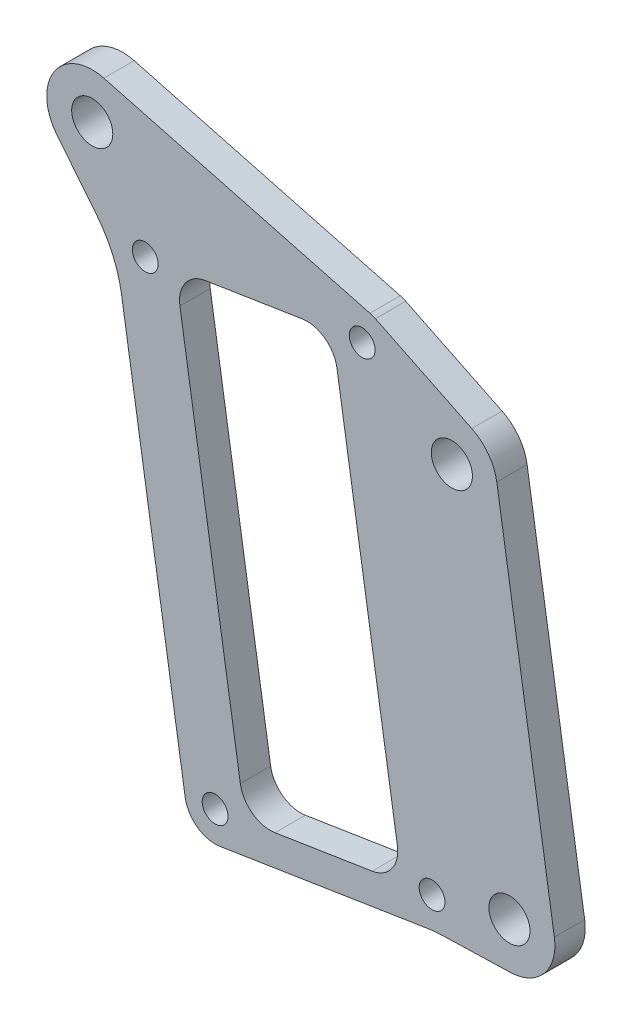
ISO-10303-21;
HEADER;
FILE_DESCRIPTION(('STEP AP214'),'2;1');
FILE_NAME('part.step','',(''),(''),'','','');
FILE_SCHEMA(('AUTOMOTIVE_DESIGN { 1 0 10303 214 1 1 1 1 }'));
ENDSEC;
DATA;
#1=APPLICATION_CONTEXT('core data for automotive mechanical design processes');
#2=APPLICATION_PROTOCOL_DEFINITION('international standard','automotive_design',2000,#1);
#3=PRODUCT_CONTEXT('',#1,'mechanical');
#4=PRODUCT('Part','Part','',(#3));
#5=PRODUCT_RELATED_PRODUCT_CATEGORY('part','',(#4));
#6=PRODUCT_DEFINITION_FORMATION('','',#4);
#7=PRODUCT_DEFINITION_CONTEXT('part definition',#1,'design');
#8=PRODUCT_DEFINITION('design','',#6,#7);
#9=PRODUCT_DEFINITION_SHAPE('','',#8);
#10=(LENGTH_UNIT() NAMED_UNIT(*) SI_UNIT(.MILLI.,.METRE.));
#11=(NAMED_UNIT(*) PLANE_ANGLE_UNIT() SI_UNIT($,.RADIAN.));
#12=(NAMED_UNIT(*) SI_UNIT($,.STERADIAN.) SOLID_ANGLE_UNIT());
#13=UNCERTAINTY_MEASURE_WITH_UNIT(LENGTH_MEASURE(1.E-05),#10,'distance_accuracy_value','');
#14=(GEOMETRIC_REPRESENTATION_CONTEXT(3) GLOBAL_UNCERTAINTY_ASSIGNED_CONTEXT((#13)) GLOBAL_UNIT_ASSIGNED_CONTEXT((#10,
#11,#12)) REPRESENTATION_CONTEXT('',''));
#15=CARTESIAN_POINT('',(0.,0.,0.));
#16=DIRECTION('',(0.,0.,1.));
#17=DIRECTION('',(1.,0.,0.));
#18=AXIS2_PLACEMENT_3D('',#15,#16,#17);
#19=CARTESIAN_POINT('',(8.90303426536302,-56.484662563122,3.175));
#20=DIRECTION('',(0.155696447577263,-0.987804948464939,0.));
#21=DIRECTION('',(0.987804948464939,0.155696447577263,0.));
#22=AXIS2_PLACEMENT_3D('',#19,#20,#21);
#23=PLANE('',#22);
#24=DIRECTION('',(-0.987804948464939,-0.155696447577263,0.));
#25=VECTOR('',#24,1.);
#26=CARTESIAN_POINT('',(8.90303426536302,-56.484662563122,3.175));
#27=LINE('',#26,#25);
#28=CARTESIAN_POINT('',(29.3160235253921,-53.2671954739377,3.175));
#29=VERTEX_POINT('',#28);
#30=CARTESIAN_POINT('',(19.1416325562032,-54.8708688839835,3.175));
#31=VERTEX_POINT('',#30);
#32=EDGE_CURVE('E367',#29,#31,#27,.T.);
#33=ORIENTED_EDGE('',*,*,#32,.F.);
#34=DIRECTION('',(0.,0.,-1.));
#35=VECTOR('',#34,1.);
#36=CARTESIAN_POINT('',(29.316023525392,-53.2671954739377,3.175));
#37=LINE('',#36,#35);
#38=CARTESIAN_POINT('',(29.3160235253921,-53.2671954739377,0.));
#39=VERTEX_POINT('',#38);
#40=EDGE_CURVE('E211',#29,#39,#37,.T.);
#41=ORIENTED_EDGE('',*,*,#40,.T.);
#42=DIRECTION('',(-0.987804948464939,-0.155696447577263,0.));
#43=VECTOR('',#42,1.);
#44=CARTESIAN_POINT('',(8.90303426536302,-56.484662563122,0.));
#45=LINE('',#44,#43);
#46=CARTESIAN_POINT('',(19.1416325562032,-54.8708688839835,0.));
#47=VERTEX_POINT('',#46);
#48=EDGE_CURVE('E313',#39,#47,#45,.T.);
#49=ORIENTED_EDGE('',*,*,#48,.T.);
#50=DIRECTION('',(0.,0.,-1.));
#51=VECTOR('',#50,1.);
#52=CARTESIAN_POINT('',(19.1416325562032,-54.8708688839835,3.175));
#53=LINE('',#52,#51);
#54=EDGE_CURVE('E209',#47,#31,#53,.F.);
#55=ORIENTED_EDGE('',*,*,#54,.T.);
#56=EDGE_LOOP('',(#33,#41,#49,#55));
#57=FACE_BOUND('',#56,.T.);
#58=ADVANCED_FACE('F35',(#57),#23,.F.);
#59=CARTESIAN_POINT('',(7.10231757946395,1.11945745808068,3.175));
#60=DIRECTION('',(-0.987804948464939,-0.155696447577263,0.));
#61=DIRECTION('',(0.155696447577263,-0.987804948464939,0.));
#62=AXIS2_PLACEMENT_3D('',#59,#60,#61);
#63=PLANE('',#62);
#64=DIRECTION('',(-0.155696447577263,0.987804948464939,0.));
#65=VECTOR('',#64,1.);
#66=CARTESIAN_POINT('',(7.10231757946395,1.11945745808068,3.175));
#67=LINE('',#66,#65);
#68=CARTESIAN_POINT('',(15.5110156237692,-52.2289243936652,3.175));
#69=VERTEX_POINT('',#68);
#70=CARTESIAN_POINT('',(9.18195502975343,-12.0746532385654,3.175));
#71=VERTEX_POINT('',#70);
#72=EDGE_CURVE('E370',#69,#71,#67,.T.);
#73=ORIENTED_EDGE('',*,*,#72,.F.);
#74=DIRECTION('',(0.,0.,-1.));
#75=VECTOR('',#74,1.);
#76=CARTESIAN_POINT('',(15.5110156237692,-52.2289243936652,0.));
#77=LINE('',#76,#75);
#78=CARTESIAN_POINT('',(15.5110156237692,-52.2289243936652,0.));
#79=VERTEX_POINT('',#78);
#80=EDGE_CURVE('E231',#69,#79,#77,.T.);
#81=ORIENTED_EDGE('',*,*,#80,.T.);
#82=DIRECTION('',(-0.155696447577263,0.987804948464939,0.));
#83=VECTOR('',#82,1.);
#84=CARTESIAN_POINT('',(7.10231757946395,1.11945745808068,0.));
#85=LINE('',#84,#83);
#86=CARTESIAN_POINT('',(9.18195502975343,-12.0746532385654,0.));
#87=VERTEX_POINT('',#86);
#88=EDGE_CURVE('E316',#79,#87,#85,.T.);
#89=ORIENTED_EDGE('',*,*,#88,.T.);
#90=DIRECTION('',(0.,0.,-1.));
#91=VECTOR('',#90,1.);
#92=CARTESIAN_POINT('',(9.18195502975343,-12.0746532385654,3.175));
#93=LINE('',#92,#91);
#94=EDGE_CURVE('E229',#87,#71,#93,.F.);
#95=ORIENTED_EDGE('',*,*,#94,.T.);
#96=EDGE_LOOP('',(#73,#81,#89,#95));
#97=FACE_BOUND('',#96,.T.);
#98=ADVANCED_FACE('F456',(#97),#63,.F.);
#99=CARTESIAN_POINT('',(1.58530122923167,-10.0578299852699,3.175));
#100=DIRECTION('',(0.155696447577263,-0.987804948464939,0.));
#101=DIRECTION('',(0.987804948464939,0.155696447577263,0.));
#102=AXIS2_PLACEMENT_3D('',#99,#100,#101);
#103=PLANE('',#102);
#104=DIRECTION('',(-0.987804948464939,-0.155696447577263,0.));
#105=VECTOR('',#104,1.);
#106=CARTESIAN_POINT('',(1.58530122923167,-10.0578299852699,0.));
#107=LINE('',#106,#105);
#108=CARTESIAN_POINT('',(21.9982904892607,-6.84036289608557,0.));
#109=VERTEX_POINT('',#108);
#110=CARTESIAN_POINT('',(11.8238995200718,-8.44403630613138,0.));
#111=VERTEX_POINT('',#110);
#112=EDGE_CURVE('E319',#109,#111,#107,.T.);
#113=ORIENTED_EDGE('',*,*,#112,.F.);
#114=DIRECTION('',(0.,0.,-1.));
#115=VECTOR('',#114,1.);
#116=CARTESIAN_POINT('',(21.9982904892607,-6.84036289608557,3.175));
#117=LINE('',#116,#115);
#118=CARTESIAN_POINT('',(21.9982904892607,-6.84036289608557,3.175));
#119=VERTEX_POINT('',#118);
#120=EDGE_CURVE('E227',#109,#119,#117,.F.);
#121=ORIENTED_EDGE('',*,*,#120,.T.);
#122=DIRECTION('',(-0.987804948464939,-0.155696447577263,0.));
#123=VECTOR('',#122,1.);
#124=CARTESIAN_POINT('',(1.58530122923167,-10.0578299852699,3.175));
#125=LINE('',#124,#123);
#126=CARTESIAN_POINT('',(11.8238995200718,-8.44403630613138,3.175));
#127=VERTEX_POINT('',#126);
#128=EDGE_CURVE('E373',#119,#127,#125,.T.);
#129=ORIENTED_EDGE('',*,*,#128,.T.);
#130=DIRECTION('',(0.,0.,-1.));
#131=VECTOR('',#130,1.);
#132=CARTESIAN_POINT('',(11.8238995200718,-8.44403630613138,3.175));
#133=LINE('',#132,#131);
#134=EDGE_CURVE('E224',#127,#111,#133,.T.);
#135=ORIENTED_EDGE('',*,*,#134,.T.);
#136=EDGE_LOOP('',(#113,#121,#129,#135));
#137=FACE_BOUND('',#136,.T.);
#138=ADVANCED_FACE('F462',(#137),#103,.T.);
#139=CARTESIAN_POINT('',(0.829756156711589,0.130785015965065,3.175));
#140=DIRECTION('',(0.987804948464939,0.155696447577263,0.));
#141=DIRECTION('',(-0.155696447577263,0.987804948464939,0.));
#142=AXIS2_PLACEMENT_3D('',#139,#140,#141);
#143=PLANE('',#142);
#144=DIRECTION('',(0.155696447577263,-0.987804948464939,0.));
#145=VECTOR('',#144,1.);
#146=CARTESIAN_POINT('',(0.829756156711589,0.130785015965065,3.175));
#147=LINE('',#146,#145);
#148=CARTESIAN_POINT('',(3.07411275133575,-14.1083744818103,3.175));
#149=VERTEX_POINT('',#148);
#150=CARTESIAN_POINT('',(9.73279042207462,-56.353877547157,3.175));
#151=VERTEX_POINT('',#150);
#152=EDGE_CURVE('E183',#149,#151,#147,.T.);
#153=ORIENTED_EDGE('',*,*,#152,.F.);
#154=DIRECTION('',(0.,0.,-1.));
#155=VECTOR('',#154,1.);
#156=CARTESIAN_POINT('',(3.07411275133575,-14.1083744818103,0.));
#157=LINE('',#156,#155);
#158=CARTESIAN_POINT('',(3.07411275133575,-14.1083744818103,0.));
#159=VERTEX_POINT('',#158);
#160=EDGE_CURVE('E255',#149,#159,#157,.T.);
#161=ORIENTED_EDGE('',*,*,#160,.T.);
#162=DIRECTION('',(0.155696447577263,-0.987804948464939,0.));
#163=VECTOR('',#162,1.);
#164=CARTESIAN_POINT('',(0.829756156711589,0.130785015965065,0.));
#165=LINE('',#164,#163);
#166=CARTESIAN_POINT('',(9.73279042207462,-56.353877547157,0.));
#167=VERTEX_POINT('',#166);
#168=EDGE_CURVE('E207',#159,#167,#165,.T.);
#169=ORIENTED_EDGE('',*,*,#168,.T.);
#170=DIRECTION('',(0.,0.,-1.));
#171=VECTOR('',#170,1.);
#172=CARTESIAN_POINT('',(9.73279042207462,-56.353877547157,3.175));
#173=LINE('',#172,#171);
#174=EDGE_CURVE('E200',#151,#167,#173,.T.);
#175=ORIENTED_EDGE('',*,*,#174,.F.);
#176=EDGE_LOOP('',(#153,#161,#169,#175));
#177=FACE_BOUND('',#176,.T.);
#178=ADVANCED_FACE('F206',(#177),#143,.F.);
#179=CARTESIAN_POINT('',(12.8690711334508,-55.8595413260991,3.175));
#180=DIRECTION('',(0.,0.,-1.));
#181=DIRECTION('',(-1.,0.,0.));
#182=AXIS2_PLACEMENT_3D('',#179,#180,#181);
#183=CYLINDRICAL_SURFACE('',#182,3.175);
#184=CARTESIAN_POINT('',(12.8690711334508,-55.8595413260991,0.));
#185=DIRECTION('',(0.,0.,1.));
#186=DIRECTION('',(1.,0.,0.));
#187=AXIS2_PLACEMENT_3D('',#184,#185,#186);
#188=CIRCLE('',#187,3.175);
#189=CARTESIAN_POINT('',(13.3634073545086,-58.9958220374753,0.));
#190=VERTEX_POINT('',#189);
#191=EDGE_CURVE('E285',#167,#190,#188,.T.);
#192=ORIENTED_EDGE('',*,*,#191,.T.);
#193=DIRECTION('',(0.,0.,-1.));
#194=VECTOR('',#193,1.);
#195=CARTESIAN_POINT('',(13.3634073545086,-58.9958220374753,3.175));
#196=LINE('',#195,#194);
#197=CARTESIAN_POINT('',(13.3634073545086,-58.9958220374753,3.175));
#198=VERTEX_POINT('',#197);
#199=EDGE_CURVE('E202',#198,#190,#196,.T.);
#200=ORIENTED_EDGE('',*,*,#199,.F.);
#201=CARTESIAN_POINT('',(12.8690711334508,-55.8595413260991,3.175));
#202=DIRECTION('',(0.,0.,1.));
#203=DIRECTION('',(1.,0.,0.));
#204=AXIS2_PLACEMENT_3D('',#201,#202,#203);
#205=CIRCLE('',#204,3.175);
#206=EDGE_CURVE('E188',#151,#198,#205,.T.);
#207=ORIENTED_EDGE('',*,*,#206,.F.);
#208=ORIENTED_EDGE('',*,*,#174,.T.);
#209=EDGE_LOOP('',(#192,#200,#207,#208));
#210=FACE_BOUND('',#209,.T.);
#211=ADVANCED_FACE('F199',(#210),#183,.T.);
#212=CARTESIAN_POINT('',(9.39737048642085,-59.6209432744982,3.175));
#213=DIRECTION('',(-0.155696447577263,0.987804948464939,0.));
#214=DIRECTION('',(-0.987804948464939,-0.155696447577263,0.));
#215=AXIS2_PLACEMENT_3D('',#212,#213,#214);
#216=PLANE('',#215);
#217=DIRECTION('',(0.987804948464939,0.155696447577263,0.));
#218=VECTOR('',#217,1.);
#219=CARTESIAN_POINT('',(9.39737048642085,-59.6209432744982,0.));
#220=LINE('',#219,#218);
#221=CARTESIAN_POINT('',(35.0841509977817,-55.5722285140277,0.));
#222=VERTEX_POINT('',#221);
#223=EDGE_CURVE('E280',#190,#222,#220,.T.);
#224=ORIENTED_EDGE('',*,*,#223,.T.);
#225=DIRECTION('',(0.,0.,-1.));
#226=VECTOR('',#225,1.);
#227=CARTESIAN_POINT('',(35.0841509977817,-55.5722285140277,3.175));
#228=LINE('',#227,#226);
#229=CARTESIAN_POINT('',(35.0841509977817,-55.5722285140277,3.175));
#230=VERTEX_POINT('',#229);
#231=EDGE_CURVE('E253',#222,#230,#228,.F.);
#232=ORIENTED_EDGE('',*,*,#231,.T.);
#233=DIRECTION('',(0.987804948464939,0.155696447577263,0.));
#234=VECTOR('',#233,1.);
#235=CARTESIAN_POINT('',(9.39737048642085,-59.6209432744982,3.175));
#236=LINE('',#235,#234);
#237=EDGE_CURVE('E204',#198,#230,#236,.T.);
#238=ORIENTED_EDGE('',*,*,#237,.F.);
#239=ORIENTED_EDGE('',*,*,#199,.T.);
#240=EDGE_LOOP('',(#224,#232,#238,#239));
#241=FACE_BOUND('',#240,.T.);
#242=ADVANCED_FACE('F284',(#241),#216,.F.);
#243=CARTESIAN_POINT('',(1.64419097695076,-56.4436622450715,3.175));
#244=DIRECTION('',(-0.0291174202977759,0.999575998028765,0.));
#245=DIRECTION('',(-0.999575998028766,-0.0291174202977759,0.));
#246=AXIS2_PLACEMENT_3D('',#243,#244,#245);
#247=PLANE('',#246);
#248=DIRECTION('',(0.999575998028766,0.0291174202977759,0.));
#249=VECTOR('',#248,1.);
#250=CARTESIAN_POINT('',(1.64419097695076,-56.4436622450715,3.175));
#251=LINE('',#250,#249);
#252=CARTESIAN_POINT('',(36.6917046442312,-55.4227361845671,3.175));
#253=VERTEX_POINT('',#252);
#254=CARTESIAN_POINT('',(43.8330714083435,-55.2147098034002,3.175));
#255=VERTEX_POINT('',#254);
#256=EDGE_CURVE('E263',#253,#255,#251,.T.);
#257=ORIENTED_EDGE('',*,*,#256,.F.);
#258=DIRECTION('',(0.,0.,-1.));
#259=VECTOR('',#258,1.);
#260=CARTESIAN_POINT('',(36.6917046442312,-55.4227361845671,0.));
#261=LINE('',#260,#259);
#262=CARTESIAN_POINT('',(36.6917046442312,-55.4227361845671,0.));
#263=VERTEX_POINT('',#262);
#264=EDGE_CURVE('E250',#253,#263,#261,.T.);
#265=ORIENTED_EDGE('',*,*,#264,.T.);
#266=DIRECTION('',(0.999575998028766,0.0291174202977759,0.));
#267=VECTOR('',#266,1.);
#268=CARTESIAN_POINT('',(1.64419097695076,-56.4436622450715,0.));
#269=LINE('',#268,#267);
#270=CARTESIAN_POINT('',(43.8330714083435,-55.2147098034002,0.));
#271=VERTEX_POINT('',#270);
#272=EDGE_CURVE('E282',#263,#271,#269,.T.);
#273=ORIENTED_EDGE('',*,*,#272,.T.);
#274=DIRECTION('',(0.,0.,-1.));
#275=VECTOR('',#274,1.);
#276=CARTESIAN_POINT('',(43.8330714083435,-55.2147098034002,3.175));
#277=LINE('',#276,#275);
#278=EDGE_CURVE('E213',#255,#271,#277,.T.);
#279=ORIENTED_EDGE('',*,*,#278,.F.);
#280=EDGE_LOOP('',(#257,#265,#273,#279));
#281=FACE_BOUND('',#280,.T.);
#282=ADVANCED_FACE('F269',(#281),#247,.F.);
#283=CARTESIAN_POINT('',(43.6943996941753,-50.4542291127882,3.175));
#284=DIRECTION('',(0.,0.,-1.));
#285=DIRECTION('',(-1.,0.,0.));
#286=AXIS2_PLACEMENT_3D('',#283,#284,#285);
#287=CYLINDRICAL_SURFACE('',#286,4.7625);
#288=CARTESIAN_POINT('',(43.6943996941753,-50.4542291127882,0.));
#289=DIRECTION('',(0.,0.,1.));
#290=DIRECTION('',(1.,0.,0.));
#291=AXIS2_PLACEMENT_3D('',#288,#289,#290);
#292=CIRCLE('',#291,4.7625);
#293=CARTESIAN_POINT('',(48.3988207612396,-49.7127247812015,0.));
#294=VERTEX_POINT('',#293);
#295=EDGE_CURVE('E287',#271,#294,#292,.T.);
#296=ORIENTED_EDGE('',*,*,#295,.T.);
#297=DIRECTION('',(0.,0.,-1.));
#298=VECTOR('',#297,1.);
#299=CARTESIAN_POINT('',(48.3988207612396,-49.7127247812015,3.175));
#300=LINE('',#299,#298);
#301=CARTESIAN_POINT('',(48.3988207612396,-49.7127247812015,3.175));
#302=VERTEX_POINT('',#301);
#303=EDGE_CURVE('E338',#302,#294,#300,.T.);
#304=ORIENTED_EDGE('',*,*,#303,.F.);
#305=CARTESIAN_POINT('',(43.6943996941753,-50.4542291127882,3.175));
#306=DIRECTION('',(0.,0.,1.));
#307=DIRECTION('',(1.,0.,0.));
#308=AXIS2_PLACEMENT_3D('',#305,#306,#307);
#309=CIRCLE('',#308,4.7625);
#310=EDGE_CURVE('E273',#255,#302,#309,.T.);
#311=ORIENTED_EDGE('',*,*,#310,.F.);
#312=ORIENTED_EDGE('',*,*,#278,.T.);
#313=EDGE_LOOP('',(#296,#304,#311,#312));
#314=FACE_BOUND('',#313,.T.);
#315=ADVANCED_FACE('F340',(#314),#287,.T.);
#316=CARTESIAN_POINT('',(39.5798625775682,6.23852310974967,3.175));
#317=DIRECTION('',(0.987804948464939,0.155696447577263,0.));
#318=DIRECTION('',(-0.155696447577263,0.987804948464939,0.));
#319=AXIS2_PLACEMENT_3D('',#316,#317,#318);
#320=PLANE('',#319);
#321=DIRECTION('',(0.155696447577263,-0.987804948464939,0.));
#322=VECTOR('',#321,1.);
#323=CARTESIAN_POINT('',(39.5798625775682,6.23852310974967,0.));
#324=LINE('',#323,#322);
#325=CARTESIAN_POINT('',(42.3679188643343,-11.4501001024121,0.));
#326=VERTEX_POINT('',#325);
#327=EDGE_CURVE('E294',#326,#294,#324,.T.);
#328=ORIENTED_EDGE('',*,*,#327,.F.);
#329=DIRECTION('',(0.,0.,-1.));
#330=VECTOR('',#329,1.);
#331=CARTESIAN_POINT('',(42.3679188643343,-11.4501001024121,3.175));
#332=LINE('',#331,#330);
#333=CARTESIAN_POINT('',(42.3679188643343,-11.4501001024121,3.175));
#334=VERTEX_POINT('',#333);
#335=EDGE_CURVE('E336',#334,#326,#332,.T.);
#336=ORIENTED_EDGE('',*,*,#335,.F.);
#337=DIRECTION('',(0.155696447577263,-0.987804948464939,0.));
#338=VECTOR('',#337,1.);
#339=CARTESIAN_POINT('',(39.5798625775682,6.23852310974967,3.175));
#340=LINE('',#339,#338);
#341=EDGE_CURVE('E349',#334,#302,#340,.T.);
#342=ORIENTED_EDGE('',*,*,#341,.T.);
#343=ORIENTED_EDGE('',*,*,#303,.T.);
#344=EDGE_LOOP('',(#328,#336,#342,#343));
#345=FACE_BOUND('',#344,.T.);
#346=ADVANCED_FACE('F345',(#345),#320,.T.);
#347=CARTESIAN_POINT('',(37.66349779727,-12.1916044339988,3.175));
#348=DIRECTION('',(0.,0.,-1.));
#349=DIRECTION('',(-1.,0.,0.));
#350=AXIS2_PLACEMENT_3D('',#347,#348,#349);
#351=CYLINDRICAL_SURFACE('',#350,4.7625);
#352=CARTESIAN_POINT('',(37.66349779727,-12.1916044339988,0.));
#353=DIRECTION('',(0.,0.,1.));
#354=DIRECTION('',(1.,0.,0.));
#355=AXIS2_PLACEMENT_3D('',#352,#353,#354);
#356=CIRCLE('',#355,4.7625);
#357=CARTESIAN_POINT('',(39.7486886780721,-7.90985417964954,0.));
#358=VERTEX_POINT('',#357);
#359=EDGE_CURVE('E297',#326,#358,#356,.T.);
#360=ORIENTED_EDGE('',*,*,#359,.T.);
#361=DIRECTION('',(0.,0.,-1.));
#362=VECTOR('',#361,1.);
#363=CARTESIAN_POINT('',(39.7486886780721,-7.90985417964954,3.175));
#364=LINE('',#363,#362);
#365=CARTESIAN_POINT('',(39.7486886780721,-7.90985417964954,3.175));
#366=VERTEX_POINT('',#365);
#367=EDGE_CURVE('E334',#366,#358,#364,.T.);
#368=ORIENTED_EDGE('',*,*,#367,.F.);
#369=CARTESIAN_POINT('',(37.66349779727,-12.1916044339988,3.175));
#370=DIRECTION('',(0.,0.,1.));
#371=DIRECTION('',(1.,0.,0.));
#372=AXIS2_PLACEMENT_3D('',#369,#370,#371);
#373=CIRCLE('',#372,4.7625);
#374=EDGE_CURVE('E350',#334,#366,#373,.T.);
#375=ORIENTED_EDGE('',*,*,#374,.F.);
#376=ORIENTED_EDGE('',*,*,#335,.T.);
#377=EDGE_LOOP('',(#360,#368,#375,#376));
#378=FACE_BOUND('',#377,.T.);
#379=ADVANCED_FACE('F486',(#378),#351,.T.);
#380=CARTESIAN_POINT('',(4.50619532063545,9.25306317897224,3.175));
#381=DIRECTION('',(0.437835355548989,0.899055171516904,0.));
#382=DIRECTION('',(-0.899055171516904,0.437835355548989,0.));
#383=AXIS2_PLACEMENT_3D('',#380,#381,#382);
#384=PLANE('',#383);
#385=DIRECTION('',(0.899055171516904,-0.437835355548989,0.));
#386=VECTOR('',#385,1.);
#387=CARTESIAN_POINT('',(4.50619532063545,9.25306317897224,0.));
#388=LINE('',#387,#386);
#389=CARTESIAN_POINT('',(29.6609791658811,-2.99719028440379,0.));
#390=VERTEX_POINT('',#389);
#391=EDGE_CURVE('E300',#390,#358,#388,.T.);
#392=ORIENTED_EDGE('',*,*,#391,.F.);
#393=DIRECTION('',(0.,0.,-1.));
#394=VECTOR('',#393,1.);
#395=CARTESIAN_POINT('',(29.6609791658811,-2.99719028440379,3.175));
#396=LINE('',#395,#394);
#397=CARTESIAN_POINT('',(29.6609791658811,-2.99719028440379,3.175));
#398=VERTEX_POINT('',#397);
#399=EDGE_CURVE('E332',#398,#390,#396,.T.);
#400=ORIENTED_EDGE('',*,*,#399,.F.);
#401=DIRECTION('',(0.899055171516904,-0.437835355548989,0.));
#402=VECTOR('',#401,1.);
#403=CARTESIAN_POINT('',(4.50619532063545,9.25306317897224,3.175));
#404=LINE('',#403,#402);
#405=EDGE_CURVE('E352',#398,#366,#404,.T.);
#406=ORIENTED_EDGE('',*,*,#405,.T.);
#407=ORIENTED_EDGE('',*,*,#367,.T.);
#408=EDGE_LOOP('',(#392,#400,#406,#407));
#409=FACE_BOUND('',#408,.T.);
#410=ADVANCED_FACE('F482',(#409),#384,.T.);
#411=CARTESIAN_POINT('',(28.270851912013,-5.85169045396996,3.175));
#412=DIRECTION('',(0.,0.,-1.));
#413=DIRECTION('',(-1.,0.,0.));
#414=AXIS2_PLACEMENT_3D('',#411,#412,#413);
#415=CYLINDRICAL_SURFACE('',#414,3.175);
#416=CARTESIAN_POINT('',(28.270851912013,-5.85169045396996,0.));
#417=DIRECTION('',(0.,0.,1.));
#418=DIRECTION('',(1.,0.,0.));
#419=AXIS2_PLACEMENT_3D('',#416,#417,#418);
#420=CIRCLE('',#419,3.175);
#421=CARTESIAN_POINT('',(29.0843817694965,-2.78268504977417,0.));
#422=VERTEX_POINT('',#421);
#423=EDGE_CURVE('E303',#390,#422,#420,.T.);
#424=ORIENTED_EDGE('',*,*,#423,.T.);
#425=DIRECTION('',(0.,0.,-1.));
#426=VECTOR('',#425,1.);
#427=CARTESIAN_POINT('',(29.0843817694965,-2.78268504977417,3.175));
#428=LINE('',#427,#426);
#429=CARTESIAN_POINT('',(29.0843817694965,-2.78268504977417,3.175));
#430=VERTEX_POINT('',#429);
#431=EDGE_CURVE('E330',#430,#422,#428,.T.);
#432=ORIENTED_EDGE('',*,*,#431,.F.);
#433=CARTESIAN_POINT('',(28.270851912013,-5.85169045396996,3.175));
#434=DIRECTION('',(0.,0.,1.));
#435=DIRECTION('',(1.,0.,0.));
#436=AXIS2_PLACEMENT_3D('',#433,#434,#435);
#437=CIRCLE('',#436,3.175);
#438=EDGE_CURVE('E358',#398,#430,#437,.T.);
#439=ORIENTED_EDGE('',*,*,#438,.F.);
#440=ORIENTED_EDGE('',*,*,#399,.T.);
#441=EDGE_LOOP('',(#424,#432,#439,#440));
#442=FACE_BOUND('',#441,.T.);
#443=ADVANCED_FACE('F478',(#442),#415,.T.);
#444=CARTESIAN_POINT('',(1.22029478622523,4.60350810629392,3.175));
#445=DIRECTION('',(0.256229876372738,0.966615875337257,0.));
#446=DIRECTION('',(-0.966615875337257,0.256229876372738,0.));
#447=AXIS2_PLACEMENT_3D('',#444,#445,#446);
#448=PLANE('',#447);
#449=DIRECTION('',(0.966615875337257,-0.256229876372738,0.));
#450=VECTOR('',#449,1.);
#451=CARTESIAN_POINT('',(1.22029478622523,4.60350810629392,0.));
#452=LINE('',#451,#450);
#453=CARTESIAN_POINT('',(1.22029478622603,4.60350810629371,0.));
#454=VERTEX_POINT('',#453);
#455=EDGE_CURVE('E306',#454,#422,#452,.T.);
#456=ORIENTED_EDGE('',*,*,#455,.F.);
#457=DIRECTION('',(0.,0.,-1.));
#458=VECTOR('',#457,1.);
#459=CARTESIAN_POINT('',(1.22029478622603,4.60350810629371,3.175));
#460=LINE('',#459,#458);
#461=CARTESIAN_POINT('',(1.22029478622603,4.60350810629371,3.175));
#462=VERTEX_POINT('',#461);
#463=EDGE_CURVE('E327',#462,#454,#460,.T.);
#464=ORIENTED_EDGE('',*,*,#463,.F.);
#465=DIRECTION('',(0.966615875337257,-0.256229876372738,0.));
#466=VECTOR('',#465,1.);
#467=CARTESIAN_POINT('',(1.22029478622523,4.60350810629392,3.175));
#468=LINE('',#467,#466);
#469=EDGE_CURVE('E360',#462,#430,#468,.T.);
#470=ORIENTED_EDGE('',*,*,#469,.T.);
#471=ORIENTED_EDGE('',*,*,#431,.T.);
#472=EDGE_LOOP('',(#456,#464,#470,#471));
#473=FACE_BOUND('',#472,.T.);
#474=ADVANCED_FACE('F474',(#473),#448,.T.);
#475=CARTESIAN_POINT('',(8.60422844084496E-13,0.,3.175));
#476=DIRECTION('',(0.,0.,-1.));
#477=DIRECTION('',(-1.,0.,0.));
#478=AXIS2_PLACEMENT_3D('',#475,#476,#477);
#479=CYLINDRICAL_SURFACE('',#478,4.7625);
#480=CARTESIAN_POINT('',(8.60422844084496E-13,0.,0.));
#481=DIRECTION('',(0.,0.,1.));
#482=DIRECTION('',(1.,0.,0.));
#483=AXIS2_PLACEMENT_3D('',#480,#481,#482);
#484=CIRCLE('',#483,4.7625);
#485=CARTESIAN_POINT('',(-3.71068828103246,-2.98533058990153,0.));
#486=VERTEX_POINT('',#485);
#487=EDGE_CURVE('E309',#454,#486,#484,.T.);
#488=ORIENTED_EDGE('',*,*,#487,.T.);
#489=DIRECTION('',(0.,0.,-1.));
#490=VECTOR('',#489,1.);
#491=CARTESIAN_POINT('',(-3.71068828103246,-2.98533058990153,3.175));
#492=LINE('',#491,#490);
#493=CARTESIAN_POINT('',(-3.71068828103246,-2.98533058990153,3.175));
#494=VERTEX_POINT('',#493);
#495=EDGE_CURVE('E324',#494,#486,#492,.T.);
#496=ORIENTED_EDGE('',*,*,#495,.F.);
#497=CARTESIAN_POINT('',(8.60422844084496E-13,0.,3.175));
#498=DIRECTION('',(0.,0.,1.));
#499=DIRECTION('',(1.,0.,0.));
#500=AXIS2_PLACEMENT_3D('',#497,#498,#499);
#501=CIRCLE('',#500,4.7625);
#502=EDGE_CURVE('E363',#462,#494,#501,.T.);
#503=ORIENTED_EDGE('',*,*,#502,.F.);
#504=ORIENTED_EDGE('',*,*,#463,.T.);
#505=EDGE_LOOP('',(#488,#496,#503,#504));
#506=FACE_BOUND('',#505,.T.);
#507=ADVANCED_FACE('F471',(#506),#479,.T.);
#508=CARTESIAN_POINT('',(-3.71068828103279,-2.98533058990112,3.175));
#509=DIRECTION('',(0.779147145623795,0.626841068745733,0.));
#510=DIRECTION('',(-0.626841068745733,0.779147145623795,0.));
#511=AXIS2_PLACEMENT_3D('',#508,#509,#510);
#512=PLANE('',#511);
#513=DIRECTION('',(0.626841068745733,-0.779147145623795,0.));
#514=VECTOR('',#513,1.);
#515=CARTESIAN_POINT('',(-3.71068828103279,-2.98533058990112,0.));
#516=LINE('',#515,#514);
#517=CARTESIAN_POINT('',(0.42415865525322,-8.12483779297071,0.));
#518=VERTEX_POINT('',#517);
#519=EDGE_CURVE('E311',#486,#518,#516,.T.);
#520=ORIENTED_EDGE('',*,*,#519,.T.);
#521=DIRECTION('',(0.,0.,-1.));
#522=VECTOR('',#521,1.);
#523=CARTESIAN_POINT('',(0.424158655253219,-8.12483779297071,3.175));
#524=LINE('',#523,#522);
#525=CARTESIAN_POINT('',(0.42415865525322,-8.12483779297071,3.175));
#526=VERTEX_POINT('',#525);
#527=EDGE_CURVE('E50',#518,#526,#524,.F.);
#528=ORIENTED_EDGE('',*,*,#527,.T.);
#529=DIRECTION('',(0.626841068745733,-0.779147145623795,0.));
#530=VECTOR('',#529,1.);
#531=CARTESIAN_POINT('',(-3.71068828103279,-2.98533058990112,3.175));
#532=LINE('',#531,#530);
#533=EDGE_CURVE('E365',#494,#526,#532,.T.);
#534=ORIENTED_EDGE('',*,*,#533,.F.);
#535=ORIENTED_EDGE('',*,*,#495,.T.);
#536=EDGE_LOOP('',(#520,#528,#534,#535));
#537=FACE_BOUND('',#536,.T.);
#538=ADVANCED_FACE('F468',(#537),#512,.F.);
#539=CARTESIAN_POINT('',(23.5492699714052,3.71180331024211,3.175));
#540=DIRECTION('',(-0.987804948464939,-0.155696447577263,0.));
#541=DIRECTION('',(0.155696447577263,-0.987804948464939,0.));
#542=AXIS2_PLACEMENT_3D('',#539,#540,#541);
#543=PLANE('',#542);
#544=DIRECTION('',(-0.155696447577263,0.987804948464939,0.));
#545=VECTOR('',#544,1.);
#546=CARTESIAN_POINT('',(23.5492699714052,3.71180331024211,0.));
#547=LINE('',#546,#545);
#548=CARTESIAN_POINT('',(31.9579680157104,-49.6365785415037,0.));
#549=VERTEX_POINT('',#548);
#550=CARTESIAN_POINT('',(25.6289074216947,-9.48230738640394,0.));
#551=VERTEX_POINT('',#550);
#552=EDGE_CURVE('E195',#549,#551,#547,.T.);
#553=ORIENTED_EDGE('',*,*,#552,.F.);
#554=DIRECTION('',(0.,0.,-1.));
#555=VECTOR('',#554,1.);
#556=CARTESIAN_POINT('',(31.9579680157104,-49.6365785415037,3.175));
#557=LINE('',#556,#555);
#558=CARTESIAN_POINT('',(31.9579680157104,-49.6365785415037,3.175));
#559=VERTEX_POINT('',#558);
#560=EDGE_CURVE('E222',#549,#559,#557,.F.);
#561=ORIENTED_EDGE('',*,*,#560,.T.);
#562=DIRECTION('',(-0.155696447577263,0.987804948464939,0.));
#563=VECTOR('',#562,1.);
#564=CARTESIAN_POINT('',(23.5492699714052,3.71180331024211,3.175));
#565=LINE('',#564,#563);
#566=CARTESIAN_POINT('',(25.6289074216947,-9.48230738640394,3.175));
#567=VERTEX_POINT('',#566);
#568=EDGE_CURVE('E328',#559,#567,#565,.T.);
#569=ORIENTED_EDGE('',*,*,#568,.T.);
#570=DIRECTION('',(0.,0.,-1.));
#571=VECTOR('',#570,1.);
#572=CARTESIAN_POINT('',(25.6289074216947,-9.48230738640394,0.));
#573=LINE('',#572,#571);
#574=EDGE_CURVE('E219',#567,#551,#573,.T.);
#575=ORIENTED_EDGE('',*,*,#574,.T.);
#576=EDGE_LOOP('',(#553,#561,#569,#575));
#577=FACE_BOUND('',#576,.T.);
#578=ADVANCED_FACE('F428',(#577),#543,.T.);
#579=CARTESIAN_POINT('',(0.,0.,3.175));
#580=DIRECTION('',(0.,0.,1.));
#581=DIRECTION('',(1.,0.,0.));
#582=AXIS2_PLACEMENT_3D('',#579,#580,#581);
#583=PLANE('',#582);
#584=CARTESIAN_POINT('',(0.,0.,3.175));
#585=DIRECTION('',(0.,0.,1.));
#586=DIRECTION('',(1.,0.,0.));
#587=AXIS2_PLACEMENT_3D('',#584,#585,#586);
#588=CIRCLE('',#587,2.15264999999999);
#589=CARTESIAN_POINT('',(2.15264999999999,0.,3.175));
#590=VERTEX_POINT('',#589);
#591=EDGE_CURVE('E420',#590,#590,#588,.T.);
#592=ORIENTED_EDGE('',*,*,#591,.F.);
#593=EDGE_LOOP('',(#592));
#594=FACE_BOUND('',#593,.T.);
#595=CARTESIAN_POINT('',(37.66349779727,-12.1916044339988,3.175));
#596=DIRECTION('',(0.,0.,1.));
#597=DIRECTION('',(1.,0.,0.));
#598=AXIS2_PLACEMENT_3D('',#595,#596,#597);
#599=CIRCLE('',#598,2.15264999999999);
#600=CARTESIAN_POINT('',(39.81614779727,-12.1916044339988,3.175));
#601=VERTEX_POINT('',#600);
#602=EDGE_CURVE('E414',#601,#601,#599,.T.);
#603=ORIENTED_EDGE('',*,*,#602,.F.);
#604=EDGE_LOOP('',(#603));
#605=FACE_BOUND('',#604,.T.);
#606=CARTESIAN_POINT('',(43.6943996941753,-50.4542291127882,3.175));
#607=DIRECTION('',(0.,0.,1.));
#608=DIRECTION('',(1.,0.,0.));
#609=AXIS2_PLACEMENT_3D('',#606,#607,#608);
#610=CIRCLE('',#609,2.15264999999999);
#611=CARTESIAN_POINT('',(45.8470496941753,-50.4542291127882,3.175));
#612=VERTEX_POINT('',#611);
#613=EDGE_CURVE('E408',#612,#612,#610,.T.);
#614=ORIENTED_EDGE('',*,*,#613,.F.);
#615=EDGE_LOOP('',(#614));
#616=FACE_BOUND('',#615,.T.);
#617=CARTESIAN_POINT('',(5.55133809731944,-9.43270874824701,3.175));
#618=DIRECTION('',(0.,0.,1.));
#619=DIRECTION('',(1.,0.,0.));
#620=AXIS2_PLACEMENT_3D('',#617,#618,#619);
#621=CIRCLE('',#620,1.35254999999999);
#622=CARTESIAN_POINT('',(6.90388809731943,-9.43270874824701,3.175));
#623=VERTEX_POINT('',#622);
#624=EDGE_CURVE('E402',#623,#623,#621,.T.);
#625=ORIENTED_EDGE('',*,*,#624,.F.);
#626=EDGE_LOOP('',(#625));
#627=FACE_BOUND('',#626,.T.);
#628=CARTESIAN_POINT('',(28.270851912013,-5.85169045396996,3.175));
#629=DIRECTION('',(0.,0.,1.));
#630=DIRECTION('',(1.,0.,0.));
#631=AXIS2_PLACEMENT_3D('',#628,#629,#630);
#632=CIRCLE('',#631,1.35254999999999);
#633=CARTESIAN_POINT('',(29.623401912013,-5.85169045396996,3.175));
#634=VERTEX_POINT('',#633);
#635=EDGE_CURVE('E396',#634,#634,#632,.T.);
#636=ORIENTED_EDGE('',*,*,#635,.F.);
#637=EDGE_LOOP('',(#636));
#638=FACE_BOUND('',#637,.T.);
#639=CARTESIAN_POINT('',(35.5885849481444,-52.2785230318221,3.175));
#640=DIRECTION('',(0.,0.,1.));
#641=DIRECTION('',(1.,0.,0.));
#642=AXIS2_PLACEMENT_3D('',#639,#640,#641);
#643=CIRCLE('',#642,1.35254999999999);
#644=CARTESIAN_POINT('',(36.9411349481444,-52.2785230318221,3.175));
#645=VERTEX_POINT('',#644);
#646=EDGE_CURVE('E390',#645,#645,#643,.T.);
#647=ORIENTED_EDGE('',*,*,#646,.F.);
#648=EDGE_LOOP('',(#647));
#649=FACE_BOUND('',#648,.T.);
#650=CARTESIAN_POINT('',(12.8690711334508,-55.8595413260991,3.175));
#651=DIRECTION('',(0.,0.,1.));
#652=DIRECTION('',(1.,0.,0.));
#653=AXIS2_PLACEMENT_3D('',#650,#651,#652);
#654=CIRCLE('',#653,1.35254999999999);
#655=CARTESIAN_POINT('',(14.2216211334508,-55.8595413260991,3.175));
#656=VERTEX_POINT('',#655);
#657=EDGE_CURVE('E379',#656,#656,#654,.T.);
#658=ORIENTED_EDGE('',*,*,#657,.F.);
#659=EDGE_LOOP('',(#658));
#660=FACE_BOUND('',#659,.T.);
#661=ORIENTED_EDGE('',*,*,#533,.T.);
#662=CARTESIAN_POINT('',(-9.47101009416897,-16.0857193660415,3.175));
#663=DIRECTION('',(0.,0.,1.));
#664=DIRECTION('',(1.,0.,0.));
#665=AXIS2_PLACEMENT_3D('',#662,#663,#664);
#666=CIRCLE('',#665,12.7);
#667=EDGE_CURVE('E11',#526,#149,#666,.F.);
#668=ORIENTED_EDGE('',*,*,#667,.T.);
#669=ORIENTED_EDGE('',*,*,#152,.T.);
#670=ORIENTED_EDGE('',*,*,#206,.T.);
#671=ORIENTED_EDGE('',*,*,#237,.T.);
#672=CARTESIAN_POINT('',(37.061495882013,-68.1173513595324,3.175));
#673=DIRECTION('',(0.,0.,1.));
#674=DIRECTION('',(1.,0.,0.));
#675=AXIS2_PLACEMENT_3D('',#672,#673,#674);
#676=CIRCLE('',#675,12.7);
#677=EDGE_CURVE('E260',#230,#253,#676,.F.);
#678=ORIENTED_EDGE('',*,*,#677,.T.);
#679=ORIENTED_EDGE('',*,*,#256,.T.);
#680=ORIENTED_EDGE('',*,*,#310,.T.);
#681=ORIENTED_EDGE('',*,*,#341,.F.);
#682=ORIENTED_EDGE('',*,*,#374,.T.);
#683=ORIENTED_EDGE('',*,*,#405,.F.);
#684=ORIENTED_EDGE('',*,*,#438,.T.);
#685=ORIENTED_EDGE('',*,*,#469,.F.);
#686=ORIENTED_EDGE('',*,*,#502,.T.);
#687=EDGE_LOOP('',(#661,#668,#669,#670,#671,#678,#679,#680,#681,#682,#683,#684,#685,#686));
#688=FACE_BOUND('',#687,.T.);
#689=ORIENTED_EDGE('',*,*,#568,.F.);
#690=CARTESIAN_POINT('',(28.8216873043342,-50.1309147625615,3.175));
#691=DIRECTION('',(0.,0.,1.));
#692=DIRECTION('',(1.,0.,0.));
#693=AXIS2_PLACEMENT_3D('',#690,#691,#692);
#694=CIRCLE('',#693,3.175);
#695=EDGE_CURVE('E236',#559,#29,#694,.F.);
#696=ORIENTED_EDGE('',*,*,#695,.T.);
#697=ORIENTED_EDGE('',*,*,#32,.T.);
#698=CARTESIAN_POINT('',(18.6472963351453,-51.7345881726073,3.175));
#699=DIRECTION('',(0.,0.,1.));
#700=DIRECTION('',(1.,0.,0.));
#701=AXIS2_PLACEMENT_3D('',#698,#699,#700);
#702=CIRCLE('',#701,3.175);
#703=EDGE_CURVE('E244',#31,#69,#702,.F.);
#704=ORIENTED_EDGE('',*,*,#703,.T.);
#705=ORIENTED_EDGE('',*,*,#72,.T.);
#706=CARTESIAN_POINT('',(12.3182357411296,-11.5803170175076,3.175));
#707=DIRECTION('',(0.,0.,1.));
#708=DIRECTION('',(1.,0.,0.));
#709=AXIS2_PLACEMENT_3D('',#706,#707,#708);
#710=CIRCLE('',#709,3.175);
#711=EDGE_CURVE('E248',#71,#127,#710,.F.);
#712=ORIENTED_EDGE('',*,*,#711,.T.);
#713=ORIENTED_EDGE('',*,*,#128,.F.);
#714=CARTESIAN_POINT('',(22.4926267103185,-9.97664360746175,3.175));
#715=DIRECTION('',(0.,0.,1.));
#716=DIRECTION('',(1.,0.,0.));
#717=AXIS2_PLACEMENT_3D('',#714,#715,#716);
#718=CIRCLE('',#717,3.175);
#719=EDGE_CURVE('E240',#119,#567,#718,.F.);
#720=ORIENTED_EDGE('',*,*,#719,.T.);
#721=EDGE_LOOP('',(#689,#696,#697,#704,#705,#712,#713,#720));
#722=FACE_BOUND('',#721,.T.);
#723=ADVANCED_FACE('F185',(#594,#605,#616,#627,#638,#649,#660,#688,#722),#583,.T.);
#724=CARTESIAN_POINT('',(0.,0.,0.));
#725=DIRECTION('',(0.,0.,1.));
#726=DIRECTION('',(1.,0.,0.));
#727=AXIS2_PLACEMENT_3D('',#724,#725,#726);
#728=PLANE('',#727);
#729=CARTESIAN_POINT('',(0.,0.,0.));
#730=DIRECTION('',(0.,0.,1.));
#731=DIRECTION('',(1.,0.,0.));
#732=AXIS2_PLACEMENT_3D('',#729,#730,#731);
#733=CIRCLE('',#732,2.15264999999999);
#734=CARTESIAN_POINT('',(2.15264999999999,0.,0.));
#735=VERTEX_POINT('',#734);
#736=EDGE_CURVE('E417',#735,#735,#733,.T.);
#737=ORIENTED_EDGE('',*,*,#736,.T.);
#738=EDGE_LOOP('',(#737));
#739=FACE_BOUND('',#738,.T.);
#740=CARTESIAN_POINT('',(37.66349779727,-12.1916044339988,0.));
#741=DIRECTION('',(0.,0.,1.));
#742=DIRECTION('',(1.,0.,0.));
#743=AXIS2_PLACEMENT_3D('',#740,#741,#742);
#744=CIRCLE('',#743,2.15264999999999);
#745=CARTESIAN_POINT('',(39.81614779727,-12.1916044339988,0.));
#746=VERTEX_POINT('',#745);
#747=EDGE_CURVE('E411',#746,#746,#744,.T.);
#748=ORIENTED_EDGE('',*,*,#747,.T.);
#749=EDGE_LOOP('',(#748));
#750=FACE_BOUND('',#749,.T.);
#751=CARTESIAN_POINT('',(43.6943996941753,-50.4542291127882,0.));
#752=DIRECTION('',(0.,0.,1.));
#753=DIRECTION('',(1.,0.,0.));
#754=AXIS2_PLACEMENT_3D('',#751,#752,#753);
#755=CIRCLE('',#754,2.15264999999999);
#756=CARTESIAN_POINT('',(45.8470496941753,-50.4542291127882,0.));
#757=VERTEX_POINT('',#756);
#758=EDGE_CURVE('E405',#757,#757,#755,.T.);
#759=ORIENTED_EDGE('',*,*,#758,.T.);
#760=EDGE_LOOP('',(#759));
#761=FACE_BOUND('',#760,.T.);
#762=CARTESIAN_POINT('',(5.55133809731944,-9.43270874824701,0.));
#763=DIRECTION('',(0.,0.,1.));
#764=DIRECTION('',(1.,0.,0.));
#765=AXIS2_PLACEMENT_3D('',#762,#763,#764);
#766=CIRCLE('',#765,1.35254999999999);
#767=CARTESIAN_POINT('',(6.90388809731943,-9.43270874824701,0.));
#768=VERTEX_POINT('',#767);
#769=EDGE_CURVE('E399',#768,#768,#766,.T.);
#770=ORIENTED_EDGE('',*,*,#769,.T.);
#771=EDGE_LOOP('',(#770));
#772=FACE_BOUND('',#771,.T.);
#773=CARTESIAN_POINT('',(28.270851912013,-5.85169045396996,0.));
#774=DIRECTION('',(0.,0.,1.));
#775=DIRECTION('',(1.,0.,0.));
#776=AXIS2_PLACEMENT_3D('',#773,#774,#775);
#777=CIRCLE('',#776,1.35254999999999);
#778=CARTESIAN_POINT('',(29.623401912013,-5.85169045396996,0.));
#779=VERTEX_POINT('',#778);
#780=EDGE_CURVE('E393',#779,#779,#777,.T.);
#781=ORIENTED_EDGE('',*,*,#780,.T.);
#782=EDGE_LOOP('',(#781));
#783=FACE_BOUND('',#782,.T.);
#784=CARTESIAN_POINT('',(35.5885849481444,-52.2785230318221,0.));
#785=DIRECTION('',(0.,0.,1.));
#786=DIRECTION('',(1.,0.,0.));
#787=AXIS2_PLACEMENT_3D('',#784,#785,#786);
#788=CIRCLE('',#787,1.35254999999999);
#789=CARTESIAN_POINT('',(36.9411349481444,-52.2785230318221,0.));
#790=VERTEX_POINT('',#789);
#791=EDGE_CURVE('E384',#790,#790,#788,.T.);
#792=ORIENTED_EDGE('',*,*,#791,.T.);
#793=EDGE_LOOP('',(#792));
#794=FACE_BOUND('',#793,.T.);
#795=CARTESIAN_POINT('',(12.8690711334508,-55.8595413260991,0.));
#796=DIRECTION('',(0.,0.,1.));
#797=DIRECTION('',(1.,0.,0.));
#798=AXIS2_PLACEMENT_3D('',#795,#796,#797);
#799=CIRCLE('',#798,1.35254999999999);
#800=CARTESIAN_POINT('',(14.2216211334508,-55.8595413260991,0.));
#801=VERTEX_POINT('',#800);
#802=EDGE_CURVE('E377',#801,#801,#799,.T.);
#803=ORIENTED_EDGE('',*,*,#802,.T.);
#804=EDGE_LOOP('',(#803));
#805=FACE_BOUND('',#804,.T.);
#806=ORIENTED_EDGE('',*,*,#168,.F.);
#807=CARTESIAN_POINT('',(-9.47101009416897,-16.0857193660415,0.));
#808=DIRECTION('',(0.,0.,1.));
#809=DIRECTION('',(1.,0.,0.));
#810=AXIS2_PLACEMENT_3D('',#807,#808,#809);
#811=CIRCLE('',#810,12.7);
#812=EDGE_CURVE('E43',#159,#518,#811,.T.);
#813=ORIENTED_EDGE('',*,*,#812,.T.);
#814=ORIENTED_EDGE('',*,*,#519,.F.);
#815=ORIENTED_EDGE('',*,*,#487,.F.);
#816=ORIENTED_EDGE('',*,*,#455,.T.);
#817=ORIENTED_EDGE('',*,*,#423,.F.);
#818=ORIENTED_EDGE('',*,*,#391,.T.);
#819=ORIENTED_EDGE('',*,*,#359,.F.);
#820=ORIENTED_EDGE('',*,*,#327,.T.);
#821=ORIENTED_EDGE('',*,*,#295,.F.);
#822=ORIENTED_EDGE('',*,*,#272,.F.);
#823=CARTESIAN_POINT('',(37.061495882013,-68.1173513595324,0.));
#824=DIRECTION('',(0.,0.,1.));
#825=DIRECTION('',(1.,0.,0.));
#826=AXIS2_PLACEMENT_3D('',#823,#824,#825);
#827=CIRCLE('',#826,12.7);
#828=EDGE_CURVE('E258',#263,#222,#827,.T.);
#829=ORIENTED_EDGE('',*,*,#828,.T.);
#830=ORIENTED_EDGE('',*,*,#223,.F.);
#831=ORIENTED_EDGE('',*,*,#191,.F.);
#832=EDGE_LOOP('',(#806,#813,#814,#815,#816,#817,#818,#819,#820,#821,#822,#829,#830,#831));
#833=FACE_BOUND('',#832,.T.);
#834=ORIENTED_EDGE('',*,*,#48,.F.);
#835=CARTESIAN_POINT('',(28.8216873043342,-50.1309147625615,0.));
#836=DIRECTION('',(0.,0.,1.));
#837=DIRECTION('',(1.,0.,0.));
#838=AXIS2_PLACEMENT_3D('',#835,#836,#837);
#839=CIRCLE('',#838,3.175);
#840=EDGE_CURVE('E234',#39,#549,#839,.T.);
#841=ORIENTED_EDGE('',*,*,#840,.T.);
#842=ORIENTED_EDGE('',*,*,#552,.T.);
#843=CARTESIAN_POINT('',(22.4926267103185,-9.97664360746175,0.));
#844=DIRECTION('',(0.,0.,1.));
#845=DIRECTION('',(1.,0.,0.));
#846=AXIS2_PLACEMENT_3D('',#843,#844,#845);
#847=CIRCLE('',#846,3.175);
#848=EDGE_CURVE('E238',#551,#109,#847,.T.);
#849=ORIENTED_EDGE('',*,*,#848,.T.);
#850=ORIENTED_EDGE('',*,*,#112,.T.);
#851=CARTESIAN_POINT('',(12.3182357411296,-11.5803170175076,0.));
#852=DIRECTION('',(0.,0.,1.));
#853=DIRECTION('',(1.,0.,0.));
#854=AXIS2_PLACEMENT_3D('',#851,#852,#853);
#855=CIRCLE('',#854,3.175);
#856=EDGE_CURVE('E246',#111,#87,#855,.T.);
#857=ORIENTED_EDGE('',*,*,#856,.T.);
#858=ORIENTED_EDGE('',*,*,#88,.F.);
#859=CARTESIAN_POINT('',(18.6472963351453,-51.7345881726073,0.));
#860=DIRECTION('',(0.,0.,1.));
#861=DIRECTION('',(1.,0.,0.));
#862=AXIS2_PLACEMENT_3D('',#859,#860,#861);
#863=CIRCLE('',#862,3.175);
#864=EDGE_CURVE('E242',#79,#47,#863,.T.);
#865=ORIENTED_EDGE('',*,*,#864,.T.);
#866=EDGE_LOOP('',(#834,#841,#842,#849,#850,#857,#858,#865));
#867=FACE_BOUND('',#866,.T.);
#868=ADVANCED_FACE('F278',(#739,#750,#761,#772,#783,#794,#805,#833,#867),#728,.F.);
#869=CARTESIAN_POINT('',(28.8216873043342,-50.1309147625615,3.175));
#870=DIRECTION('',(0.,0.,-1.));
#871=DIRECTION('',(-1.,0.,0.));
#872=AXIS2_PLACEMENT_3D('',#869,#870,#871);
#873=CYLINDRICAL_SURFACE('',#872,3.175);
#874=ORIENTED_EDGE('',*,*,#695,.F.);
#875=ORIENTED_EDGE('',*,*,#560,.F.);
#876=ORIENTED_EDGE('',*,*,#840,.F.);
#877=ORIENTED_EDGE('',*,*,#40,.F.);
#878=EDGE_LOOP('',(#874,#875,#876,#877));
#879=FACE_BOUND('',#878,.T.);
#880=ADVANCED_FACE('F503',(#879),#873,.F.);
#881=CARTESIAN_POINT('',(22.4926267103185,-9.97664360746175,3.175));
#882=DIRECTION('',(0.,0.,1.));
#883=DIRECTION('',(1.,0.,0.));
#884=AXIS2_PLACEMENT_3D('',#881,#882,#883);
#885=CYLINDRICAL_SURFACE('',#884,3.175);
#886=ORIENTED_EDGE('',*,*,#719,.F.);
#887=ORIENTED_EDGE('',*,*,#120,.F.);
#888=ORIENTED_EDGE('',*,*,#848,.F.);
#889=ORIENTED_EDGE('',*,*,#574,.F.);
#890=EDGE_LOOP('',(#886,#887,#888,#889));
#891=FACE_BOUND('',#890,.T.);
#892=ADVANCED_FACE('F506',(#891),#885,.F.);
#893=CARTESIAN_POINT('',(18.6472963351453,-51.7345881726073,3.175));
#894=DIRECTION('',(0.,0.,1.));
#895=DIRECTION('',(1.,0.,0.));
#896=AXIS2_PLACEMENT_3D('',#893,#894,#895);
#897=CYLINDRICAL_SURFACE('',#896,3.175);
#898=ORIENTED_EDGE('',*,*,#703,.F.);
#899=ORIENTED_EDGE('',*,*,#54,.F.);
#900=ORIENTED_EDGE('',*,*,#864,.F.);
#901=ORIENTED_EDGE('',*,*,#80,.F.);
#902=EDGE_LOOP('',(#898,#899,#900,#901));
#903=FACE_BOUND('',#902,.T.);
#904=ADVANCED_FACE('F510',(#903),#897,.F.);
#905=CARTESIAN_POINT('',(12.3182357411296,-11.5803170175076,3.175));
#906=DIRECTION('',(0.,0.,-1.));
#907=DIRECTION('',(-1.,0.,0.));
#908=AXIS2_PLACEMENT_3D('',#905,#906,#907);
#909=CYLINDRICAL_SURFACE('',#908,3.175);
#910=ORIENTED_EDGE('',*,*,#711,.F.);
#911=ORIENTED_EDGE('',*,*,#94,.F.);
#912=ORIENTED_EDGE('',*,*,#856,.F.);
#913=ORIENTED_EDGE('',*,*,#134,.F.);
#914=EDGE_LOOP('',(#910,#911,#912,#913));
#915=FACE_BOUND('',#914,.T.);
#916=ADVANCED_FACE('F514',(#915),#909,.F.);
#917=CARTESIAN_POINT('',(37.061495882013,-68.1173513595324,3.175));
#918=DIRECTION('',(0.,0.,1.));
#919=DIRECTION('',(1.,0.,0.));
#920=AXIS2_PLACEMENT_3D('',#917,#918,#919);
#921=CYLINDRICAL_SURFACE('',#920,12.7);
#922=ORIENTED_EDGE('',*,*,#677,.F.);
#923=ORIENTED_EDGE('',*,*,#231,.F.);
#924=ORIENTED_EDGE('',*,*,#828,.F.);
#925=ORIENTED_EDGE('',*,*,#264,.F.);
#926=EDGE_LOOP('',(#922,#923,#924,#925));
#927=FACE_BOUND('',#926,.T.);
#928=ADVANCED_FACE('F275',(#927),#921,.F.);
#929=CARTESIAN_POINT('',(-9.47101009416897,-16.0857193660415,3.175));
#930=DIRECTION('',(0.,0.,1.));
#931=DIRECTION('',(1.,0.,0.));
#932=AXIS2_PLACEMENT_3D('',#929,#930,#931);
#933=CYLINDRICAL_SURFACE('',#932,12.7);
#934=ORIENTED_EDGE('',*,*,#667,.F.);
#935=ORIENTED_EDGE('',*,*,#527,.F.);
#936=ORIENTED_EDGE('',*,*,#812,.F.);
#937=ORIENTED_EDGE('',*,*,#160,.F.);
#938=EDGE_LOOP('',(#934,#935,#936,#937));
#939=FACE_BOUND('',#938,.T.);
#940=ADVANCED_FACE('F37',(#939),#933,.F.);
#941=CARTESIAN_POINT('',(12.8690711334508,-55.8595413260991,3.175));
#942=DIRECTION('',(0.,0.,1.));
#943=DIRECTION('',(1.,0.,0.));
#944=AXIS2_PLACEMENT_3D('',#941,#942,#943);
#945=CYLINDRICAL_SURFACE('',#944,1.35254999999999);
#946=ORIENTED_EDGE('',*,*,#802,.F.);
#947=EDGE_LOOP('',(#946));
#948=FACE_BOUND('',#947,.T.);
#949=ORIENTED_EDGE('',*,*,#657,.T.);
#950=EDGE_LOOP('',(#949));
#951=FACE_BOUND('',#950,.T.);
#952=ADVANCED_FACE('F442',(#948,#951),#945,.F.);
#953=CARTESIAN_POINT('',(35.5885849481444,-52.2785230318221,3.175));
#954=DIRECTION('',(0.,0.,1.));
#955=DIRECTION('',(1.,0.,0.));
#956=AXIS2_PLACEMENT_3D('',#953,#954,#955);
#957=CYLINDRICAL_SURFACE('',#956,1.35254999999999);
#958=ORIENTED_EDGE('',*,*,#791,.F.);
#959=EDGE_LOOP('',(#958));
#960=FACE_BOUND('',#959,.T.);
#961=ORIENTED_EDGE('',*,*,#646,.T.);
#962=EDGE_LOOP('',(#961));
#963=FACE_BOUND('',#962,.T.);
#964=ADVANCED_FACE('F444',(#960,#963),#957,.F.);
#965=CARTESIAN_POINT('',(28.270851912013,-5.85169045396996,3.175));
#966=DIRECTION('',(0.,0.,1.));
#967=DIRECTION('',(1.,0.,0.));
#968=AXIS2_PLACEMENT_3D('',#965,#966,#967);
#969=CYLINDRICAL_SURFACE('',#968,1.35254999999999);
#970=ORIENTED_EDGE('',*,*,#780,.F.);
#971=EDGE_LOOP('',(#970));
#972=FACE_BOUND('',#971,.T.);
#973=ORIENTED_EDGE('',*,*,#635,.T.);
#974=EDGE_LOOP('',(#973));
#975=FACE_BOUND('',#974,.T.);
#976=ADVANCED_FACE('F451',(#972,#975),#969,.F.);
#977=CARTESIAN_POINT('',(5.55133809731944,-9.43270874824701,3.175));
#978=DIRECTION('',(0.,0.,1.));
#979=DIRECTION('',(1.,0.,0.));
#980=AXIS2_PLACEMENT_3D('',#977,#978,#979);
#981=CYLINDRICAL_SURFACE('',#980,1.35254999999999);
#982=ORIENTED_EDGE('',*,*,#769,.F.);
#983=EDGE_LOOP('',(#982));
#984=FACE_BOUND('',#983,.T.);
#985=ORIENTED_EDGE('',*,*,#624,.T.);
#986=EDGE_LOOP('',(#985));
#987=FACE_BOUND('',#986,.T.);
#988=ADVANCED_FACE('F547',(#984,#987),#981,.F.);
#989=CARTESIAN_POINT('',(43.6943996941753,-50.4542291127882,3.175));
#990=DIRECTION('',(0.,0.,1.));
#991=DIRECTION('',(1.,0.,0.));
#992=AXIS2_PLACEMENT_3D('',#989,#990,#991);
#993=CYLINDRICAL_SURFACE('',#992,2.15264999999999);
#994=ORIENTED_EDGE('',*,*,#758,.F.);
#995=EDGE_LOOP('',(#994));
#996=FACE_BOUND('',#995,.T.);
#997=ORIENTED_EDGE('',*,*,#613,.T.);
#998=EDGE_LOOP('',(#997));
#999=FACE_BOUND('',#998,.T.);
#1000=ADVANCED_FACE('F557',(#996,#999),#993,.F.);
#1001=CARTESIAN_POINT('',(37.66349779727,-12.1916044339988,3.175));
#1002=DIRECTION('',(0.,0.,1.));
#1003=DIRECTION('',(1.,0.,0.));
#1004=AXIS2_PLACEMENT_3D('',#1001,#1002,#1003);
#1005=CYLINDRICAL_SURFACE('',#1004,2.15264999999999);
#1006=ORIENTED_EDGE('',*,*,#747,.F.);
#1007=EDGE_LOOP('',(#1006));
#1008=FACE_BOUND('',#1007,.T.);
#1009=ORIENTED_EDGE('',*,*,#602,.T.);
#1010=EDGE_LOOP('',(#1009));
#1011=FACE_BOUND('',#1010,.T.);
#1012=ADVANCED_FACE('F587',(#1008,#1011),#1005,.F.);
#1013=CARTESIAN_POINT('',(0.,0.,3.175));
#1014=DIRECTION('',(0.,0.,1.));
#1015=DIRECTION('',(1.,0.,0.));
#1016=AXIS2_PLACEMENT_3D('',#1013,#1014,#1015);
#1017=CYLINDRICAL_SURFACE('',#1016,2.15264999999999);
#1018=ORIENTED_EDGE('',*,*,#736,.F.);
#1019=EDGE_LOOP('',(#1018));
#1020=FACE_BOUND('',#1019,.T.);
#1021=ORIENTED_EDGE('',*,*,#591,.T.);
#1022=EDGE_LOOP('',(#1021));
#1023=FACE_BOUND('',#1022,.T.);
#1024=ADVANCED_FACE('F424',(#1020,#1023),#1017,.F.);
#1025=CLOSED_SHELL('',(#58,#98,#138,#178,#211,#242,#282,#315,#346,#379,#410,#443,#474,#507,#538,
#578,#723,#868,#880,#892,#904,#916,#928,#940,#952,#964,#976,#988,#1000,#1012,#1024));
#1026=MANIFOLD_SOLID_BREP('B2',#1025);
#1027=ADVANCED_BREP_SHAPE_REPRESENTATION('',(#18,#1026),#14);
#1028=SHAPE_DEFINITION_REPRESENTATION(#9,#1027);
ENDSEC;
END-ISO-10303-21;
